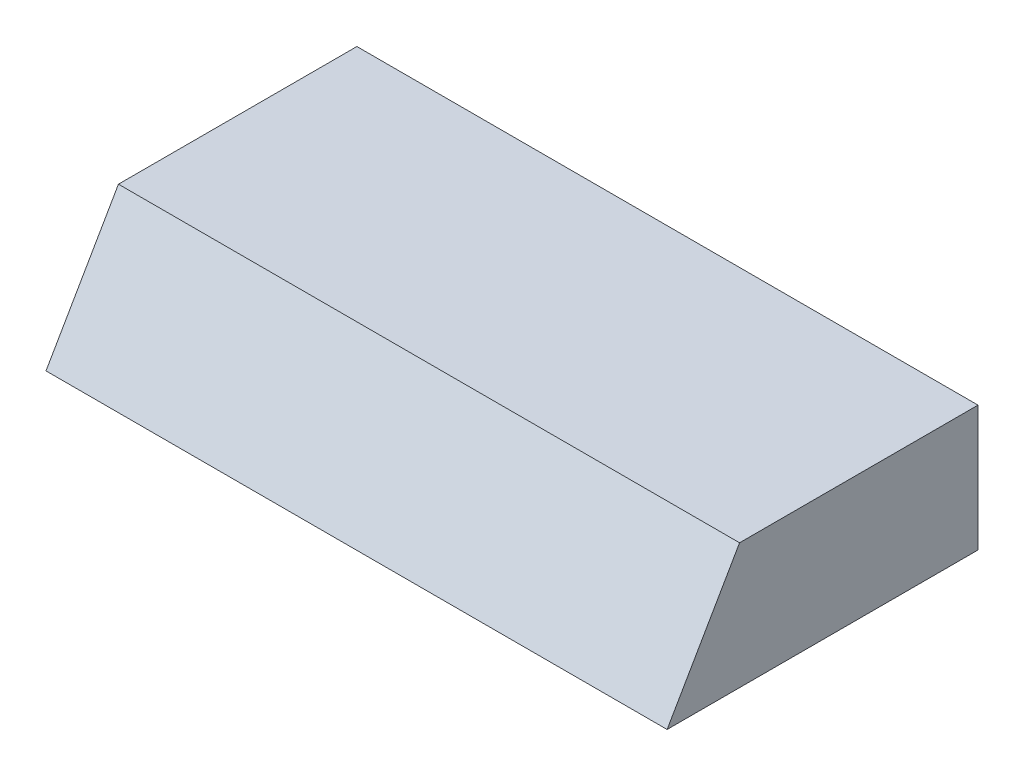
ISO-10303-21;
HEADER;
FILE_DESCRIPTION(('STEP AP214'),'2;1');
FILE_NAME('part.step','',(''),(''),'','','');
FILE_SCHEMA(('AUTOMOTIVE_DESIGN { 1 0 10303 214 1 1 1 1 }'));
ENDSEC;
DATA;
#1=APPLICATION_CONTEXT('core data for automotive mechanical design processes');
#2=APPLICATION_PROTOCOL_DEFINITION('international standard','automotive_design',2000,#1);
#3=PRODUCT_CONTEXT('',#1,'mechanical');
#4=PRODUCT('Part','Part','',(#3));
#5=PRODUCT_RELATED_PRODUCT_CATEGORY('part','',(#4));
#6=PRODUCT_DEFINITION_FORMATION('','',#4);
#7=PRODUCT_DEFINITION_CONTEXT('part definition',#1,'design');
#8=PRODUCT_DEFINITION('design','',#6,#7);
#9=PRODUCT_DEFINITION_SHAPE('','',#8);
#10=(LENGTH_UNIT() NAMED_UNIT(*) SI_UNIT(.MILLI.,.METRE.));
#11=(NAMED_UNIT(*) PLANE_ANGLE_UNIT() SI_UNIT($,.RADIAN.));
#12=(NAMED_UNIT(*) SI_UNIT($,.STERADIAN.) SOLID_ANGLE_UNIT());
#13=UNCERTAINTY_MEASURE_WITH_UNIT(LENGTH_MEASURE(1.E-05),#10,'distance_accuracy_value','');
#14=(GEOMETRIC_REPRESENTATION_CONTEXT(3) GLOBAL_UNCERTAINTY_ASSIGNED_CONTEXT((#13)) GLOBAL_UNIT_ASSIGNED_CONTEXT((#10,
#11,#12)) REPRESENTATION_CONTEXT('',''));
#15=CARTESIAN_POINT('',(0.,0.,0.));
#16=DIRECTION('',(0.,0.,1.));
#17=DIRECTION('',(1.,0.,0.));
#18=AXIS2_PLACEMENT_3D('',#15,#16,#17);
#19=CARTESIAN_POINT('',(191.,3.00000000000002,-121.179999999998));
#20=DIRECTION('',(0.,1.,0.));
#21=DIRECTION('',(0.,0.,1.));
#22=AXIS2_PLACEMENT_3D('',#19,#20,#21);
#23=PLANE('',#22);
#24=CARTESIAN_POINT('',(187.,3.00000000000002,-109.182562407702));
#25=DIRECTION('',(0.,-1.,0.));
#26=DIRECTION('',(0.,0.,1.));
#27=AXIS2_PLACEMENT_3D('',#24,#25,#26);
#28=CIRCLE('',#27,1.58499999999999);
#29=CARTESIAN_POINT('',(187.,3.00000000000002,-107.597562407702));
#30=VERTEX_POINT('',#29);
#31=EDGE_CURVE('E157',#30,#30,#28,.T.);
#32=ORIENTED_EDGE('',*,*,#31,.T.);
#33=EDGE_LOOP('',(#32));
#34=FACE_BOUND('',#33,.T.);
#35=CARTESIAN_POINT('',(187.,3.00000000000002,-39.7067759717996));
#36=DIRECTION('',(0.,-1.,0.));
#37=DIRECTION('',(0.,0.,1.));
#38=AXIS2_PLACEMENT_3D('',#35,#36,#37);
#39=CIRCLE('',#38,1.585);
#40=CARTESIAN_POINT('',(187.,3.00000000000002,-38.1217759717996));
#41=VERTEX_POINT('',#40);
#42=EDGE_CURVE('E154',#41,#41,#39,.T.);
#43=ORIENTED_EDGE('',*,*,#42,.T.);
#44=EDGE_LOOP('',(#43));
#45=FACE_BOUND('',#44,.T.);
#46=CARTESIAN_POINT('',(11.,3.00000000000002,-109.182562407702));
#47=DIRECTION('',(0.,1.,0.));
#48=DIRECTION('',(0.,0.,1.));
#49=AXIS2_PLACEMENT_3D('',#46,#47,#48);
#50=CIRCLE('',#49,1.58499999999999);
#51=CARTESIAN_POINT('',(11.,3.00000000000002,-107.597562407702));
#52=VERTEX_POINT('',#51);
#53=EDGE_CURVE('E165',#52,#52,#50,.T.);
#54=ORIENTED_EDGE('',*,*,#53,.F.);
#55=EDGE_LOOP('',(#54));
#56=FACE_BOUND('',#55,.T.);
#57=CARTESIAN_POINT('',(11.,3.00000000000002,-39.7067759717996));
#58=DIRECTION('',(0.,1.,0.));
#59=DIRECTION('',(0.,0.,1.));
#60=AXIS2_PLACEMENT_3D('',#57,#58,#59);
#61=CIRCLE('',#60,1.585);
#62=CARTESIAN_POINT('',(11.,3.00000000000002,-38.1217759717996));
#63=VERTEX_POINT('',#62);
#64=EDGE_CURVE('E169',#63,#63,#61,.T.);
#65=ORIENTED_EDGE('',*,*,#64,.F.);
#66=EDGE_LOOP('',(#65));
#67=FACE_BOUND('',#66,.T.);
#68=DIRECTION('',(0.,0.,-1.));
#69=VECTOR('',#68,1.);
#70=CARTESIAN_POINT('',(191.,3.00000000000002,-121.179999999998));
#71=LINE('',#70,#69);
#72=CARTESIAN_POINT('',(191.,3.00000000000003,-34.7067759717996));
#73=VERTEX_POINT('',#72);
#74=CARTESIAN_POINT('',(191.,3.00000000000002,-114.182562407702));
#75=VERTEX_POINT('',#74);
#76=EDGE_CURVE('E177',#73,#75,#71,.T.);
#77=ORIENTED_EDGE('',*,*,#76,.T.);
#78=DIRECTION('',(-1.,0.,0.));
#79=VECTOR('',#78,1.);
#80=CARTESIAN_POINT('',(198.,3.00000000000002,-114.182562407702));
#81=LINE('',#80,#79);
#82=CARTESIAN_POINT('',(7.,3.00000000000002,-114.182562407702));
#83=VERTEX_POINT('',#82);
#84=EDGE_CURVE('E62',#75,#83,#81,.T.);
#85=ORIENTED_EDGE('',*,*,#84,.T.);
#86=DIRECTION('',(0.,0.,1.));
#87=VECTOR('',#86,1.);
#88=CARTESIAN_POINT('',(7.,3.00000000000002,0.));
#89=LINE('',#88,#87);
#90=CARTESIAN_POINT('',(7.,3.00000000000002,-34.7067759717996));
#91=VERTEX_POINT('',#90);
#92=EDGE_CURVE('E180',#83,#91,#89,.T.);
#93=ORIENTED_EDGE('',*,*,#92,.T.);
#94=DIRECTION('',(1.,0.,0.));
#95=VECTOR('',#94,1.);
#96=CARTESIAN_POINT('',(191.,3.00000000000002,-34.7067759717996));
#97=LINE('',#96,#95);
#98=EDGE_CURVE('E11',#91,#73,#97,.T.);
#99=ORIENTED_EDGE('',*,*,#98,.T.);
#100=EDGE_LOOP('',(#77,#85,#93,#99));
#101=FACE_BOUND('',#100,.T.);
#102=DIRECTION('',(-0.999999971675547,0.,0.000238010305419276));
#103=VECTOR('',#102,1.);
#104=CARTESIAN_POINT('',(187.260930966553,3.00000000000002,-91.4995849728758));
#105=LINE('',#104,#103);
#106=CARTESIAN_POINT('',(187.260930966553,3.00000000000002,-91.4995849728758));
#107=VERTEX_POINT('',#106);
#108=CARTESIAN_POINT('',(77.260934082243,3.00000000000002,-91.4734038392797));
#109=VERTEX_POINT('',#108);
#110=EDGE_CURVE('E337',#107,#109,#105,.T.);
#111=ORIENTED_EDGE('',*,*,#110,.F.);
#112=DIRECTION('',(0.00041021225149326,0.,-0.999999915862951));
#113=VECTOR('',#112,1.);
#114=CARTESIAN_POINT('',(187.246573537751,3.00000000000002,-56.4995879176725));
#115=LINE('',#114,#113);
#116=CARTESIAN_POINT('',(187.246573537751,3.00000000000002,-56.4995879176725));
#117=VERTEX_POINT('',#116);
#118=EDGE_CURVE('E152',#117,#107,#115,.T.);
#119=ORIENTED_EDGE('',*,*,#118,.F.);
#120=DIRECTION('',(0.999999971675547,0.,-0.000238010305419276));
#121=VECTOR('',#120,1.);
#122=CARTESIAN_POINT('',(187.246573537751,3.00000000000002,-56.4995879176725));
#123=LINE('',#122,#121);
#124=CARTESIAN_POINT('',(77.2465766534407,3.00000000000002,-56.4734067840764));
#125=VERTEX_POINT('',#124);
#126=EDGE_CURVE('E148',#125,#117,#123,.T.);
#127=ORIENTED_EDGE('',*,*,#126,.F.);
#128=DIRECTION('',(-0.000410212251492863,0.,0.999999915862951));
#129=VECTOR('',#128,1.);
#130=CARTESIAN_POINT('',(77.2465766534407,3.00000000000002,-56.4734067840764));
#131=LINE('',#130,#129);
#132=EDGE_CURVE('E339',#109,#125,#131,.T.);
#133=ORIENTED_EDGE('',*,*,#132,.F.);
#134=EDGE_LOOP('',(#111,#119,#127,#133));
#135=FACE_BOUND('',#134,.T.);
#136=ADVANCED_FACE('F37',(#34,#45,#56,#67,#101,#135),#23,.T.);
#137=CARTESIAN_POINT('',(198.,32.9999853798931,-45.2007372036753));
#138=DIRECTION('',(0.,-1.,0.));
#139=DIRECTION('',(0.,0.,-1.));
#140=AXIS2_PLACEMENT_3D('',#137,#138,#139);
#141=PLANE('',#140);
#142=DIRECTION('',(-1.,0.,0.));
#143=VECTOR('',#142,1.);
#144=CARTESIAN_POINT('',(191.,32.9999853798931,-52.0259787266658));
#145=LINE('',#144,#143);
#146=CARTESIAN_POINT('',(191.,32.9999853798931,-52.0259787266658));
#147=VERTEX_POINT('',#146);
#148=CARTESIAN_POINT('',(7.00000000000001,32.9999853798931,-52.0259787266658));
#149=VERTEX_POINT('',#148);
#150=EDGE_CURVE('E186',#147,#149,#145,.T.);
#151=ORIENTED_EDGE('',*,*,#150,.T.);
#152=DIRECTION('',(0.,0.,1.));
#153=VECTOR('',#152,1.);
#154=CARTESIAN_POINT('',(7.00000000000001,32.9999853798931,-45.2007372036753));
#155=LINE('',#154,#153);
#156=CARTESIAN_POINT('',(7.,32.9999853798931,-114.208212057437));
#157=VERTEX_POINT('',#156);
#158=EDGE_CURVE('E191',#157,#149,#155,.T.);
#159=ORIENTED_EDGE('',*,*,#158,.F.);
#160=DIRECTION('',(-1.,0.,0.));
#161=VECTOR('',#160,1.);
#162=CARTESIAN_POINT('',(198.,32.9999853798931,-114.208212057437));
#163=LINE('',#162,#161);
#164=CARTESIAN_POINT('',(191.,32.9999853798931,-114.208212057437));
#165=VERTEX_POINT('',#164);
#166=EDGE_CURVE('E192',#165,#157,#163,.T.);
#167=ORIENTED_EDGE('',*,*,#166,.F.);
#168=DIRECTION('',(0.,0.,1.));
#169=VECTOR('',#168,1.);
#170=CARTESIAN_POINT('',(191.,32.9999853798931,-45.2007372036753));
#171=LINE('',#170,#169);
#172=EDGE_CURVE('E196',#165,#147,#171,.T.);
#173=ORIENTED_EDGE('',*,*,#172,.T.);
#174=EDGE_LOOP('',(#151,#159,#167,#173));
#175=FACE_BOUND('',#174,.T.);
#176=ADVANCED_FACE('F278',(#175),#141,.T.);
#177=CARTESIAN_POINT('',(191.,0.,-32.9748548522839));
#178=DIRECTION('',(0.,-0.499971920924447,-0.866041614639342));
#179=DIRECTION('',(0.,0.866041614639342,-0.499971920924447));
#180=AXIS2_PLACEMENT_3D('',#177,#178,#179);
#181=PLANE('',#180);
#182=ORIENTED_EDGE('',*,*,#98,.F.);
#183=DIRECTION('',(0.,0.866041614639342,-0.499971920924447));
#184=VECTOR('',#183,1.);
#185=CARTESIAN_POINT('',(7.,-14.2779963984741,-24.7320670166552));
#186=LINE('',#185,#184);
#187=EDGE_CURVE('E46',#91,#149,#186,.T.);
#188=ORIENTED_EDGE('',*,*,#187,.T.);
#189=ORIENTED_EDGE('',*,*,#150,.F.);
#190=DIRECTION('',(0.,-0.866041614639342,0.499971920924447));
#191=VECTOR('',#190,1.);
#192=CARTESIAN_POINT('',(191.,0.,-32.9748548522839));
#193=LINE('',#192,#191);
#194=EDGE_CURVE('E184',#147,#73,#193,.T.);
#195=ORIENTED_EDGE('',*,*,#194,.T.);
#196=EDGE_LOOP('',(#182,#188,#189,#195));
#197=FACE_BOUND('',#196,.T.);
#198=ADVANCED_FACE('F286',(#197),#181,.T.);
#199=CARTESIAN_POINT('',(7.,0.,0.));
#200=DIRECTION('',(1.,0.,0.));
#201=DIRECTION('',(0.,0.,-1.));
#202=AXIS2_PLACEMENT_3D('',#199,#200,#201);
#203=PLANE('',#202);
#204=ORIENTED_EDGE('',*,*,#92,.F.);
#205=DIRECTION('',(0.,0.999999634497327,-0.00085498842867307));
#206=VECTOR('',#205,1.);
#207=CARTESIAN_POINT('',(7.00000000000001,0.00598491900073231,-114.180002558517));
#208=LINE('',#207,#206);
#209=EDGE_CURVE('E189',#83,#157,#208,.T.);
#210=ORIENTED_EDGE('',*,*,#209,.T.);
#211=ORIENTED_EDGE('',*,*,#158,.T.);
#212=ORIENTED_EDGE('',*,*,#187,.F.);
#213=EDGE_LOOP('',(#204,#210,#211,#212));
#214=FACE_BOUND('',#213,.T.);
#215=ADVANCED_FACE('F296',(#214),#203,.T.);
#216=CARTESIAN_POINT('',(191.,0.,0.));
#217=DIRECTION('',(1.,0.,0.));
#218=DIRECTION('',(0.,0.,-1.));
#219=AXIS2_PLACEMENT_3D('',#216,#217,#218);
#220=PLANE('',#219);
#221=DIRECTION('',(0.,0.999999634497327,-0.00085498842867307));
#222=VECTOR('',#221,1.);
#223=CARTESIAN_POINT('',(191.,0.00598491900073231,-114.180002558517));
#224=LINE('',#223,#222);
#225=EDGE_CURVE('E197',#75,#165,#224,.T.);
#226=ORIENTED_EDGE('',*,*,#225,.F.);
#227=ORIENTED_EDGE('',*,*,#76,.F.);
#228=ORIENTED_EDGE('',*,*,#194,.F.);
#229=ORIENTED_EDGE('',*,*,#172,.F.);
#230=EDGE_LOOP('',(#226,#227,#228,#229));
#231=FACE_BOUND('',#230,.T.);
#232=ADVANCED_FACE('F300',(#231),#220,.F.);
#233=CARTESIAN_POINT('',(198.,0.00598491900073231,-114.180002558517));
#234=DIRECTION('',(0.,0.00085498842867307,0.999999634497327));
#235=DIRECTION('',(0.,-0.999999634497327,0.00085498842867307));
#236=AXIS2_PLACEMENT_3D('',#233,#234,#235);
#237=PLANE('',#236);
#238=ORIENTED_EDGE('',*,*,#84,.F.);
#239=ORIENTED_EDGE('',*,*,#225,.T.);
#240=ORIENTED_EDGE('',*,*,#166,.T.);
#241=ORIENTED_EDGE('',*,*,#209,.F.);
#242=EDGE_LOOP('',(#238,#239,#240,#241));
#243=FACE_BOUND('',#242,.T.);
#244=ADVANCED_FACE('F298',(#243),#237,.T.);
#245=CARTESIAN_POINT('',(11.,-1.99999999999998,-39.7067759717996));
#246=DIRECTION('',(0.,1.,0.));
#247=DIRECTION('',(0.,0.,1.));
#248=AXIS2_PLACEMENT_3D('',#245,#246,#247);
#249=CYLINDRICAL_SURFACE('',#248,1.585);
#250=ORIENTED_EDGE('',*,*,#64,.T.);
#251=EDGE_LOOP('',(#250));
#252=FACE_BOUND('',#251,.T.);
#253=CARTESIAN_POINT('',(11.,0.,-39.7067759717996));
#254=DIRECTION('',(0.,1.,0.));
#255=DIRECTION('',(0.,0.,1.));
#256=AXIS2_PLACEMENT_3D('',#253,#254,#255);
#257=CIRCLE('',#256,1.585);
#258=CARTESIAN_POINT('',(11.,0.,-38.1217759717996));
#259=VERTEX_POINT('',#258);
#260=EDGE_CURVE('E168',#259,#259,#257,.T.);
#261=ORIENTED_EDGE('',*,*,#260,.F.);
#262=EDGE_LOOP('',(#261));
#263=FACE_BOUND('',#262,.T.);
#264=ADVANCED_FACE('F292',(#252,#263),#249,.F.);
#265=CARTESIAN_POINT('',(11.,-1.99999999999998,-109.182562407702));
#266=DIRECTION('',(0.,1.,0.));
#267=DIRECTION('',(0.,0.,1.));
#268=AXIS2_PLACEMENT_3D('',#265,#266,#267);
#269=CYLINDRICAL_SURFACE('',#268,1.58499999999999);
#270=ORIENTED_EDGE('',*,*,#53,.T.);
#271=EDGE_LOOP('',(#270));
#272=FACE_BOUND('',#271,.T.);
#273=CARTESIAN_POINT('',(11.,0.,-109.182562407702));
#274=DIRECTION('',(0.,1.,0.));
#275=DIRECTION('',(0.,0.,1.));
#276=AXIS2_PLACEMENT_3D('',#273,#274,#275);
#277=CIRCLE('',#276,1.58499999999999);
#278=CARTESIAN_POINT('',(11.,0.,-107.597562407702));
#279=VERTEX_POINT('',#278);
#280=EDGE_CURVE('E174',#279,#279,#277,.T.);
#281=ORIENTED_EDGE('',*,*,#280,.F.);
#282=EDGE_LOOP('',(#281));
#283=FACE_BOUND('',#282,.T.);
#284=ADVANCED_FACE('F243',(#272,#283),#269,.F.);
#285=CARTESIAN_POINT('',(198.,0.,-22.1084640504235));
#286=DIRECTION('',(0.,1.,0.));
#287=DIRECTION('',(0.,0.,1.));
#288=AXIS2_PLACEMENT_3D('',#285,#286,#287);
#289=PLANE('',#288);
#290=CARTESIAN_POINT('',(187.,0.,-109.182562407702));
#291=DIRECTION('',(0.,1.,0.));
#292=DIRECTION('',(0.,0.,1.));
#293=AXIS2_PLACEMENT_3D('',#290,#291,#292);
#294=CIRCLE('',#293,1.58499999999999);
#295=CARTESIAN_POINT('',(187.,0.,-107.597562407702));
#296=VERTEX_POINT('',#295);
#297=EDGE_CURVE('E41',#296,#296,#294,.F.);
#298=ORIENTED_EDGE('',*,*,#297,.F.);
#299=EDGE_LOOP('',(#298));
#300=FACE_BOUND('',#299,.T.);
#301=CARTESIAN_POINT('',(187.,0.,-39.7067759717996));
#302=DIRECTION('',(0.,1.,0.));
#303=DIRECTION('',(0.,0.,1.));
#304=AXIS2_PLACEMENT_3D('',#301,#302,#303);
#305=CIRCLE('',#304,1.585);
#306=CARTESIAN_POINT('',(187.,0.,-38.1217759717996));
#307=VERTEX_POINT('',#306);
#308=EDGE_CURVE('E163',#307,#307,#305,.F.);
#309=ORIENTED_EDGE('',*,*,#308,.F.);
#310=EDGE_LOOP('',(#309));
#311=FACE_BOUND('',#310,.T.);
#312=ORIENTED_EDGE('',*,*,#280,.T.);
#313=EDGE_LOOP('',(#312));
#314=FACE_BOUND('',#313,.T.);
#315=ORIENTED_EDGE('',*,*,#260,.T.);
#316=EDGE_LOOP('',(#315));
#317=FACE_BOUND('',#316,.T.);
#318=DIRECTION('',(0.,0.,-1.));
#319=VECTOR('',#318,1.);
#320=CARTESIAN_POINT('',(0.,0.,-22.1084640504235));
#321=LINE('',#320,#319);
#322=CARTESIAN_POINT('',(0.,0.,-22.1084640504235));
#323=VERTEX_POINT('',#322);
#324=CARTESIAN_POINT('',(0.,0.,-121.179999999998));
#325=VERTEX_POINT('',#324);
#326=EDGE_CURVE('E195',#323,#325,#321,.T.);
#327=ORIENTED_EDGE('',*,*,#326,.T.);
#328=DIRECTION('',(-1.,0.,0.));
#329=VECTOR('',#328,1.);
#330=CARTESIAN_POINT('',(198.,0.,-121.179999999998));
#331=LINE('',#330,#329);
#332=CARTESIAN_POINT('',(198.,0.,-121.179999999998));
#333=VERTEX_POINT('',#332);
#334=EDGE_CURVE('E230',#333,#325,#331,.T.);
#335=ORIENTED_EDGE('',*,*,#334,.F.);
#336=DIRECTION('',(0.,0.,-1.));
#337=VECTOR('',#336,1.);
#338=CARTESIAN_POINT('',(198.,0.,-22.1084640504235));
#339=LINE('',#338,#337);
#340=CARTESIAN_POINT('',(198.,0.,-22.1084640504235));
#341=VERTEX_POINT('',#340);
#342=EDGE_CURVE('E203',#341,#333,#339,.T.);
#343=ORIENTED_EDGE('',*,*,#342,.F.);
#344=DIRECTION('',(-1.,0.,0.));
#345=VECTOR('',#344,1.);
#346=CARTESIAN_POINT('',(198.,0.,-22.1084640504235));
#347=LINE('',#346,#345);
#348=EDGE_CURVE('E213',#341,#323,#347,.T.);
#349=ORIENTED_EDGE('',*,*,#348,.T.);
#350=EDGE_LOOP('',(#327,#335,#343,#349));
#351=FACE_BOUND('',#350,.T.);
#352=ADVANCED_FACE('F39',(#300,#311,#314,#317,#351),#289,.F.);
#353=CARTESIAN_POINT('',(198.,0.,-121.179999999998));
#354=DIRECTION('',(0.,0.00085498842867307,0.999999634497327));
#355=DIRECTION('',(0.,-0.999999634497327,0.00085498842867307));
#356=AXIS2_PLACEMENT_3D('',#353,#354,#355);
#357=PLANE('',#356);
#358=DIRECTION('',(0.,0.999999634497327,-0.00085498842867307));
#359=VECTOR('',#358,1.);
#360=CARTESIAN_POINT('',(0.,0.,-121.179999999998));
#361=LINE('',#360,#359);
#362=CARTESIAN_POINT('',(0.,39.9999853798931,-121.214199537145));
#363=VERTEX_POINT('',#362);
#364=EDGE_CURVE('E216',#325,#363,#361,.T.);
#365=ORIENTED_EDGE('',*,*,#364,.T.);
#366=DIRECTION('',(-1.,0.,0.));
#367=VECTOR('',#366,1.);
#368=CARTESIAN_POINT('',(198.,39.9999853798931,-121.214199537145));
#369=LINE('',#368,#367);
#370=CARTESIAN_POINT('',(198.,39.9999853798931,-121.214199537145));
#371=VERTEX_POINT('',#370);
#372=EDGE_CURVE('E227',#371,#363,#369,.T.);
#373=ORIENTED_EDGE('',*,*,#372,.F.);
#374=DIRECTION('',(0.,0.999999634497327,-0.00085498842867307));
#375=VECTOR('',#374,1.);
#376=CARTESIAN_POINT('',(198.,0.,-121.179999999998));
#377=LINE('',#376,#375);
#378=EDGE_CURVE('E206',#333,#371,#377,.T.);
#379=ORIENTED_EDGE('',*,*,#378,.F.);
#380=ORIENTED_EDGE('',*,*,#334,.T.);
#381=EDGE_LOOP('',(#365,#373,#379,#380));
#382=FACE_BOUND('',#381,.T.);
#383=ADVANCED_FACE('F242',(#382),#357,.F.);
#384=CARTESIAN_POINT('',(198.,39.9999853798931,-45.2007372036753));
#385=DIRECTION('',(0.,-1.,0.));
#386=DIRECTION('',(0.,0.,-1.));
#387=AXIS2_PLACEMENT_3D('',#384,#385,#386);
#388=PLANE('',#387);
#389=DIRECTION('',(0.,0.,1.));
#390=VECTOR('',#389,1.);
#391=CARTESIAN_POINT('',(0.,39.9999853798931,-45.2007372036753));
#392=LINE('',#391,#390);
#393=CARTESIAN_POINT('',(0.,39.9999853798931,-45.2007372036753));
#394=VERTEX_POINT('',#393);
#395=EDGE_CURVE('E218',#363,#394,#392,.T.);
#396=ORIENTED_EDGE('',*,*,#395,.T.);
#397=DIRECTION('',(-1.,0.,0.));
#398=VECTOR('',#397,1.);
#399=CARTESIAN_POINT('',(198.,39.9999853798931,-45.2007372036753));
#400=LINE('',#399,#398);
#401=CARTESIAN_POINT('',(198.,39.9999853798931,-45.2007372036753));
#402=VERTEX_POINT('',#401);
#403=EDGE_CURVE('E224',#402,#394,#400,.T.);
#404=ORIENTED_EDGE('',*,*,#403,.F.);
#405=DIRECTION('',(0.,0.,1.));
#406=VECTOR('',#405,1.);
#407=CARTESIAN_POINT('',(198.,39.9999853798931,-45.2007372036753));
#408=LINE('',#407,#406);
#409=EDGE_CURVE('E209',#371,#402,#408,.T.);
#410=ORIENTED_EDGE('',*,*,#409,.F.);
#411=ORIENTED_EDGE('',*,*,#372,.T.);
#412=EDGE_LOOP('',(#396,#404,#410,#411));
#413=FACE_BOUND('',#412,.T.);
#414=ADVANCED_FACE('F261',(#413),#388,.F.);
#415=CARTESIAN_POINT('',(198.,0.,-22.1084640504235));
#416=DIRECTION('',(0.,-0.499971920924447,-0.866041614639342));
#417=DIRECTION('',(0.,0.866041614639342,-0.499971920924447));
#418=AXIS2_PLACEMENT_3D('',#415,#416,#417);
#419=PLANE('',#418);
#420=DIRECTION('',(0.,-0.866041614639342,0.499971920924447));
#421=VECTOR('',#420,1.);
#422=CARTESIAN_POINT('',(0.,0.,-22.1084640504235));
#423=LINE('',#422,#421);
#424=EDGE_CURVE('E207',#394,#323,#423,.T.);
#425=ORIENTED_EDGE('',*,*,#424,.T.);
#426=ORIENTED_EDGE('',*,*,#348,.F.);
#427=DIRECTION('',(0.,-0.866041614639342,0.499971920924447));
#428=VECTOR('',#427,1.);
#429=CARTESIAN_POINT('',(198.,17.8992168211495,-32.4418079288699));
#430=LINE('',#429,#428);
#431=EDGE_CURVE('E211',#402,#341,#430,.T.);
#432=ORIENTED_EDGE('',*,*,#431,.F.);
#433=ORIENTED_EDGE('',*,*,#403,.T.);
#434=EDGE_LOOP('',(#425,#426,#432,#433));
#435=FACE_BOUND('',#434,.T.);
#436=ADVANCED_FACE('F267',(#435),#419,.F.);
#437=CARTESIAN_POINT('',(198.,0.,0.));
#438=DIRECTION('',(1.,0.,0.));
#439=DIRECTION('',(0.,0.,-1.));
#440=AXIS2_PLACEMENT_3D('',#437,#438,#439);
#441=PLANE('',#440);
#442=ORIENTED_EDGE('',*,*,#342,.T.);
#443=ORIENTED_EDGE('',*,*,#378,.T.);
#444=ORIENTED_EDGE('',*,*,#409,.T.);
#445=ORIENTED_EDGE('',*,*,#431,.T.);
#446=EDGE_LOOP('',(#442,#443,#444,#445));
#447=FACE_BOUND('',#446,.T.);
#448=ADVANCED_FACE('F265',(#447),#441,.T.);
#449=CARTESIAN_POINT('',(0.,0.,0.));
#450=DIRECTION('',(1.,0.,0.));
#451=DIRECTION('',(0.,0.,-1.));
#452=AXIS2_PLACEMENT_3D('',#449,#450,#451);
#453=PLANE('',#452);
#454=ORIENTED_EDGE('',*,*,#364,.F.);
#455=ORIENTED_EDGE('',*,*,#326,.F.);
#456=ORIENTED_EDGE('',*,*,#424,.F.);
#457=ORIENTED_EDGE('',*,*,#395,.F.);
#458=EDGE_LOOP('',(#454,#455,#456,#457));
#459=FACE_BOUND('',#458,.T.);
#460=ADVANCED_FACE('F256',(#459),#453,.F.);
#461=CARTESIAN_POINT('',(187.,-1.99999999999998,-39.7067759717996));
#462=DIRECTION('',(0.,1.,0.));
#463=DIRECTION('',(0.,0.,1.));
#464=AXIS2_PLACEMENT_3D('',#461,#462,#463);
#465=CYLINDRICAL_SURFACE('',#464,1.585);
#466=ORIENTED_EDGE('',*,*,#42,.F.);
#467=EDGE_LOOP('',(#466));
#468=FACE_BOUND('',#467,.T.);
#469=ORIENTED_EDGE('',*,*,#308,.T.);
#470=EDGE_LOOP('',(#469));
#471=FACE_BOUND('',#470,.T.);
#472=ADVANCED_FACE('F308',(#468,#471),#465,.F.);
#473=CARTESIAN_POINT('',(187.,-1.99999999999998,-109.182562407702));
#474=DIRECTION('',(0.,1.,0.));
#475=DIRECTION('',(0.,0.,1.));
#476=AXIS2_PLACEMENT_3D('',#473,#474,#475);
#477=CYLINDRICAL_SURFACE('',#476,1.58499999999999);
#478=ORIENTED_EDGE('',*,*,#31,.F.);
#479=EDGE_LOOP('',(#478));
#480=FACE_BOUND('',#479,.T.);
#481=ORIENTED_EDGE('',*,*,#297,.T.);
#482=EDGE_LOOP('',(#481));
#483=FACE_BOUND('',#482,.T.);
#484=ADVANCED_FACE('F238',(#480,#483),#477,.F.);
#485=CARTESIAN_POINT('',(187.246573537751,28.,-56.4995879176725));
#486=DIRECTION('',(-0.999999915862951,0.,-0.00041021225149326));
#487=DIRECTION('',(-0.00041021225149326,0.,0.999999915862951));
#488=AXIS2_PLACEMENT_3D('',#485,#486,#487);
#489=PLANE('',#488);
#490=ORIENTED_EDGE('',*,*,#118,.T.);
#491=DIRECTION('',(0.,-1.,0.));
#492=VECTOR('',#491,1.);
#493=CARTESIAN_POINT('',(187.260930966553,28.,-91.4995849728758));
#494=LINE('',#493,#492);
#495=CARTESIAN_POINT('',(187.260930966553,28.,-91.4995849728758));
#496=VERTEX_POINT('',#495);
#497=EDGE_CURVE('E133',#496,#107,#494,.T.);
#498=ORIENTED_EDGE('',*,*,#497,.F.);
#499=DIRECTION('',(0.00041021225149326,0.,-0.999999915862951));
#500=VECTOR('',#499,1.);
#501=CARTESIAN_POINT('',(187.246573537751,28.,-56.4995879176725));
#502=LINE('',#501,#500);
#503=CARTESIAN_POINT('',(187.246573537751,28.,-56.4995879176725));
#504=VERTEX_POINT('',#503);
#505=EDGE_CURVE('E140',#504,#496,#502,.T.);
#506=ORIENTED_EDGE('',*,*,#505,.F.);
#507=DIRECTION('',(0.,-1.,0.));
#508=VECTOR('',#507,1.);
#509=CARTESIAN_POINT('',(187.246573537751,28.,-56.4995879176725));
#510=LINE('',#509,#508);
#511=EDGE_CURVE('E346',#504,#117,#510,.T.);
#512=ORIENTED_EDGE('',*,*,#511,.T.);
#513=EDGE_LOOP('',(#490,#498,#506,#512));
#514=FACE_BOUND('',#513,.T.);
#515=ADVANCED_FACE('F150',(#514),#489,.F.);
#516=CARTESIAN_POINT('',(187.260930966553,28.,-91.4995849728758));
#517=DIRECTION('',(0.000238010305419276,0.,0.999999971675547));
#518=DIRECTION('',(0.999999971675547,0.,-0.000238010305419276));
#519=AXIS2_PLACEMENT_3D('',#516,#517,#518);
#520=PLANE('',#519);
#521=ORIENTED_EDGE('',*,*,#110,.T.);
#522=DIRECTION('',(0.,-1.,0.));
#523=VECTOR('',#522,1.);
#524=CARTESIAN_POINT('',(77.260934082243,28.,-91.4734038392797));
#525=LINE('',#524,#523);
#526=CARTESIAN_POINT('',(77.260934082243,28.,-91.4734038392797));
#527=VERTEX_POINT('',#526);
#528=EDGE_CURVE('E136',#527,#109,#525,.T.);
#529=ORIENTED_EDGE('',*,*,#528,.F.);
#530=DIRECTION('',(-0.999999971675547,0.,0.000238010305419276));
#531=VECTOR('',#530,1.);
#532=CARTESIAN_POINT('',(187.260930966553,28.,-91.4995849728758));
#533=LINE('',#532,#531);
#534=EDGE_CURVE('E129',#496,#527,#533,.T.);
#535=ORIENTED_EDGE('',*,*,#534,.F.);
#536=ORIENTED_EDGE('',*,*,#497,.T.);
#537=EDGE_LOOP('',(#521,#529,#535,#536));
#538=FACE_BOUND('',#537,.T.);
#539=ADVANCED_FACE('F131',(#538),#520,.F.);
#540=CARTESIAN_POINT('',(77.2465766534407,28.,-56.4734067840764));
#541=DIRECTION('',(0.999999915862951,0.,0.000410212251492863));
#542=DIRECTION('',(0.000410212251492863,0.,-0.999999915862951));
#543=AXIS2_PLACEMENT_3D('',#540,#541,#542);
#544=PLANE('',#543);
#545=ORIENTED_EDGE('',*,*,#132,.T.);
#546=DIRECTION('',(0.,-1.,0.));
#547=VECTOR('',#546,1.);
#548=CARTESIAN_POINT('',(77.2465766534407,28.,-56.4734067840764));
#549=LINE('',#548,#547);
#550=CARTESIAN_POINT('',(77.2465766534407,28.,-56.4734067840764));
#551=VERTEX_POINT('',#550);
#552=EDGE_CURVE('E54',#551,#125,#549,.T.);
#553=ORIENTED_EDGE('',*,*,#552,.F.);
#554=DIRECTION('',(-0.000410212251492863,0.,0.999999915862951));
#555=VECTOR('',#554,1.);
#556=CARTESIAN_POINT('',(77.2465766534407,28.,-56.4734067840764));
#557=LINE('',#556,#555);
#558=EDGE_CURVE('E139',#527,#551,#557,.T.);
#559=ORIENTED_EDGE('',*,*,#558,.F.);
#560=ORIENTED_EDGE('',*,*,#528,.T.);
#561=EDGE_LOOP('',(#545,#553,#559,#560));
#562=FACE_BOUND('',#561,.T.);
#563=ADVANCED_FACE('F349',(#562),#544,.F.);
#564=CARTESIAN_POINT('',(187.246573537751,28.,-56.4995879176725));
#565=DIRECTION('',(-0.000238010305419276,0.,-0.999999971675547));
#566=DIRECTION('',(-0.999999971675547,0.,0.000238010305419276));
#567=AXIS2_PLACEMENT_3D('',#564,#565,#566);
#568=PLANE('',#567);
#569=ORIENTED_EDGE('',*,*,#126,.T.);
#570=ORIENTED_EDGE('',*,*,#511,.F.);
#571=DIRECTION('',(0.999999971675547,0.,-0.000238010305419276));
#572=VECTOR('',#571,1.);
#573=CARTESIAN_POINT('',(187.246573537751,28.,-56.4995879176725));
#574=LINE('',#573,#572);
#575=EDGE_CURVE('E144',#551,#504,#574,.T.);
#576=ORIENTED_EDGE('',*,*,#575,.F.);
#577=ORIENTED_EDGE('',*,*,#552,.T.);
#578=EDGE_LOOP('',(#569,#570,#576,#577));
#579=FACE_BOUND('',#578,.T.);
#580=ADVANCED_FACE('F350',(#579),#568,.F.);
#581=CARTESIAN_POINT('',(0.,28.,0.));
#582=DIRECTION('',(0.,1.,0.));
#583=DIRECTION('',(0.,0.,1.));
#584=AXIS2_PLACEMENT_3D('',#581,#582,#583);
#585=PLANE('',#584);
#586=ORIENTED_EDGE('',*,*,#505,.T.);
#587=ORIENTED_EDGE('',*,*,#534,.T.);
#588=ORIENTED_EDGE('',*,*,#558,.T.);
#589=ORIENTED_EDGE('',*,*,#575,.T.);
#590=EDGE_LOOP('',(#586,#587,#588,#589));
#591=FACE_BOUND('',#590,.T.);
#592=ADVANCED_FACE('F143',(#591),#585,.T.);
#593=CLOSED_SHELL('',(#136,#176,#198,#215,#232,#244,#264,#284,#352,#383,#414,#436,#448,#460,
#472,#484,#515,#539,#563,#580,#592));
#594=MANIFOLD_SOLID_BREP('B2',#593);
#595=ADVANCED_BREP_SHAPE_REPRESENTATION('',(#18,#594),#14);
#596=SHAPE_DEFINITION_REPRESENTATION(#9,#595);
ENDSEC;
END-ISO-10303-21;
